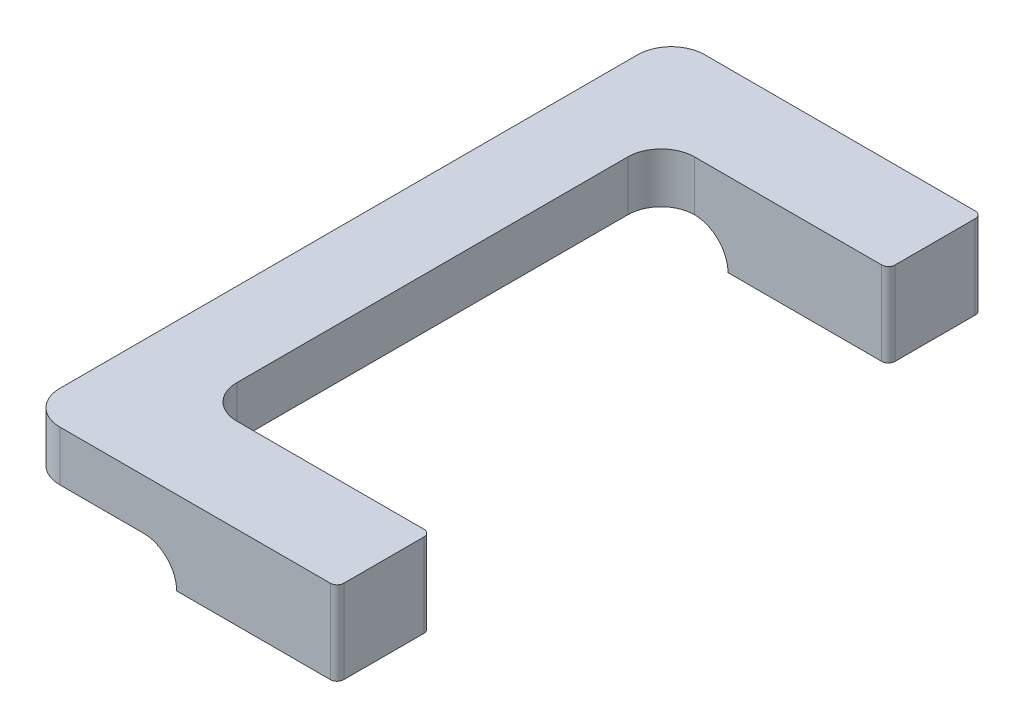
ISO-10303-21;
HEADER;
FILE_DESCRIPTION(('STEP AP214'),'2;1');
FILE_NAME('part.step','',(''),(''),'','','');
FILE_SCHEMA(('AUTOMOTIVE_DESIGN { 1 0 10303 214 1 1 1 1 }'));
ENDSEC;
DATA;
#1=APPLICATION_CONTEXT('core data for automotive mechanical design processes');
#2=APPLICATION_PROTOCOL_DEFINITION('international standard','automotive_design',2000,#1);
#3=PRODUCT_CONTEXT('',#1,'mechanical');
#4=PRODUCT('Part','Part','',(#3));
#5=PRODUCT_RELATED_PRODUCT_CATEGORY('part','',(#4));
#6=PRODUCT_DEFINITION_FORMATION('','',#4);
#7=PRODUCT_DEFINITION_CONTEXT('part definition',#1,'design');
#8=PRODUCT_DEFINITION('design','',#6,#7);
#9=PRODUCT_DEFINITION_SHAPE('','',#8);
#10=(LENGTH_UNIT() NAMED_UNIT(*) SI_UNIT(.MILLI.,.METRE.));
#11=(NAMED_UNIT(*) PLANE_ANGLE_UNIT() SI_UNIT($,.RADIAN.));
#12=(NAMED_UNIT(*) SI_UNIT($,.STERADIAN.) SOLID_ANGLE_UNIT());
#13=UNCERTAINTY_MEASURE_WITH_UNIT(LENGTH_MEASURE(1.E-05),#10,'distance_accuracy_value','');
#14=(GEOMETRIC_REPRESENTATION_CONTEXT(3) GLOBAL_UNCERTAINTY_ASSIGNED_CONTEXT((#13)) GLOBAL_UNIT_ASSIGNED_CONTEXT((#10,
#11,#12)) REPRESENTATION_CONTEXT('',''));
#15=CARTESIAN_POINT('',(0.,0.,0.));
#16=DIRECTION('',(0.,0.,1.));
#17=DIRECTION('',(1.,0.,0.));
#18=AXIS2_PLACEMENT_3D('',#15,#16,#17);
#19=CARTESIAN_POINT('',(4.74707104937555,5.,13.4130487782579));
#20=DIRECTION('',(-1.,0.,0.));
#21=DIRECTION('',(0.,0.,1.));
#22=AXIS2_PLACEMENT_3D('',#19,#20,#21);
#23=PLANE('',#22);
#24=DIRECTION('',(0.,-1.,0.));
#25=VECTOR('',#24,1.);
#26=CARTESIAN_POINT('',(4.74707104937555,5.,17.4130487782579));
#27=LINE('',#26,#25);
#28=CARTESIAN_POINT('',(4.74707104937555,4.,17.4130487782579));
#29=VERTEX_POINT('',#28);
#30=CARTESIAN_POINT('',(4.74707104937555,0.,17.4130487782579));
#31=VERTEX_POINT('',#30);
#32=EDGE_CURVE('E281',#29,#31,#27,.T.);
#33=ORIENTED_EDGE('',*,*,#32,.F.);
#34=DIRECTION('',(0.,0.,-1.));
#35=VECTOR('',#34,1.);
#36=CARTESIAN_POINT('',(4.74707104937555,4.,13.4130487782579));
#37=LINE('',#36,#35);
#38=CARTESIAN_POINT('',(4.74707104937555,4.,13.4130487782579));
#39=VERTEX_POINT('',#38);
#40=EDGE_CURVE('E264',#29,#39,#37,.T.);
#41=ORIENTED_EDGE('',*,*,#40,.T.);
#42=DIRECTION('',(0.,-1.,0.));
#43=VECTOR('',#42,1.);
#44=CARTESIAN_POINT('',(4.74707104937555,5.,13.4130487782579));
#45=LINE('',#44,#43);
#46=CARTESIAN_POINT('',(4.74707104937555,0.,13.4130487782579));
#47=VERTEX_POINT('',#46);
#48=EDGE_CURVE('E283',#39,#47,#45,.T.);
#49=ORIENTED_EDGE('',*,*,#48,.T.);
#50=DIRECTION('',(0.,0.,-1.));
#51=VECTOR('',#50,1.);
#52=CARTESIAN_POINT('',(4.74707104937555,0.,13.4130487782579));
#53=LINE('',#52,#51);
#54=EDGE_CURVE('E835',#31,#47,#53,.T.);
#55=ORIENTED_EDGE('',*,*,#54,.F.);
#56=EDGE_LOOP('',(#33,#41,#49,#55));
#57=FACE_BOUND('',#56,.T.);
#58=ADVANCED_FACE('F81',(#57),#23,.T.);
#59=CARTESIAN_POINT('',(4.74707104937555,5.,13.4130487782579));
#60=DIRECTION('',(0.,0.,1.));
#61=DIRECTION('',(1.,0.,0.));
#62=AXIS2_PLACEMENT_3D('',#59,#60,#61);
#63=PLANE('',#62);
#64=ORIENTED_EDGE('',*,*,#48,.F.);
#65=DIRECTION('',(-1.,0.,0.));
#66=VECTOR('',#65,1.);
#67=CARTESIAN_POINT('',(-3.25292895062445,4.,13.4130487782579));
#68=LINE('',#67,#66);
#69=CARTESIAN_POINT('',(-3.25292895062445,4.,13.4130487782579));
#70=VERTEX_POINT('',#69);
#71=EDGE_CURVE('E830',#39,#70,#68,.T.);
#72=ORIENTED_EDGE('',*,*,#71,.T.);
#73=DIRECTION('',(0.,-1.,0.));
#74=VECTOR('',#73,1.);
#75=CARTESIAN_POINT('',(-3.25292895062445,5.,13.4130487782579));
#76=LINE('',#75,#74);
#77=CARTESIAN_POINT('',(-3.25292895062445,0.,13.4130487782579));
#78=VERTEX_POINT('',#77);
#79=EDGE_CURVE('E275',#70,#78,#76,.T.);
#80=ORIENTED_EDGE('',*,*,#79,.T.);
#81=DIRECTION('',(-1.,0.,0.));
#82=VECTOR('',#81,1.);
#83=CARTESIAN_POINT('',(4.74707104937555,0.,13.4130487782579));
#84=LINE('',#83,#82);
#85=EDGE_CURVE('E847',#47,#78,#84,.T.);
#86=ORIENTED_EDGE('',*,*,#85,.F.);
#87=EDGE_LOOP('',(#64,#72,#80,#86));
#88=FACE_BOUND('',#87,.T.);
#89=ADVANCED_FACE('F529',(#88),#63,.T.);
#90=CARTESIAN_POINT('',(-3.25292895062445,5.,13.4130487782579));
#91=DIRECTION('',(1.,0.,0.));
#92=DIRECTION('',(0.,0.,-1.));
#93=AXIS2_PLACEMENT_3D('',#90,#91,#92);
#94=PLANE('',#93);
#95=ORIENTED_EDGE('',*,*,#79,.F.);
#96=DIRECTION('',(0.,0.,1.));
#97=VECTOR('',#96,1.);
#98=CARTESIAN_POINT('',(-3.25292895062445,4.,13.4130487782579));
#99=LINE('',#98,#97);
#100=CARTESIAN_POINT('',(-3.25292895062445,4.,17.4130487782579));
#101=VERTEX_POINT('',#100);
#102=EDGE_CURVE('E261',#70,#101,#99,.T.);
#103=ORIENTED_EDGE('',*,*,#102,.T.);
#104=DIRECTION('',(0.,-1.,0.));
#105=VECTOR('',#104,1.);
#106=CARTESIAN_POINT('',(-3.25292895062445,5.,17.4130487782579));
#107=LINE('',#106,#105);
#108=CARTESIAN_POINT('',(-3.25292895062445,0.,17.4130487782579));
#109=VERTEX_POINT('',#108);
#110=EDGE_CURVE('E273',#101,#109,#107,.T.);
#111=ORIENTED_EDGE('',*,*,#110,.T.);
#112=DIRECTION('',(0.,0.,1.));
#113=VECTOR('',#112,1.);
#114=CARTESIAN_POINT('',(-3.25292895062445,0.,13.4130487782579));
#115=LINE('',#114,#113);
#116=EDGE_CURVE('E850',#78,#109,#115,.T.);
#117=ORIENTED_EDGE('',*,*,#116,.F.);
#118=EDGE_LOOP('',(#95,#103,#111,#117));
#119=FACE_BOUND('',#118,.T.);
#120=ADVANCED_FACE('F271',(#119),#94,.T.);
#121=CARTESIAN_POINT('',(4.74707104937555,5.,17.4130487782579));
#122=DIRECTION('',(0.,0.,-1.));
#123=DIRECTION('',(-1.,0.,0.));
#124=AXIS2_PLACEMENT_3D('',#121,#122,#123);
#125=PLANE('',#124);
#126=ORIENTED_EDGE('',*,*,#110,.F.);
#127=DIRECTION('',(1.,0.,0.));
#128=VECTOR('',#127,1.);
#129=CARTESIAN_POINT('',(-3.25292895062445,4.,17.4130487782579));
#130=LINE('',#129,#128);
#131=EDGE_CURVE('E258',#101,#29,#130,.T.);
#132=ORIENTED_EDGE('',*,*,#131,.T.);
#133=ORIENTED_EDGE('',*,*,#32,.T.);
#134=DIRECTION('',(1.,0.,0.));
#135=VECTOR('',#134,1.);
#136=CARTESIAN_POINT('',(4.74707104937555,0.,17.4130487782579));
#137=LINE('',#136,#135);
#138=EDGE_CURVE('E279',#109,#31,#137,.T.);
#139=ORIENTED_EDGE('',*,*,#138,.F.);
#140=EDGE_LOOP('',(#126,#132,#133,#139));
#141=FACE_BOUND('',#140,.T.);
#142=ADVANCED_FACE('F277',(#141),#125,.T.);
#143=CARTESIAN_POINT('',(4.74707104937555,5.,-19.5869512217421));
#144=DIRECTION('',(-1.,0.,0.));
#145=DIRECTION('',(0.,0.,1.));
#146=AXIS2_PLACEMENT_3D('',#143,#144,#145);
#147=PLANE('',#146);
#148=DIRECTION('',(0.,-1.,0.));
#149=VECTOR('',#148,1.);
#150=CARTESIAN_POINT('',(4.74707104937555,5.,-15.5869512217421));
#151=LINE('',#150,#149);
#152=CARTESIAN_POINT('',(4.74707104937555,4.,-15.5869512217421));
#153=VERTEX_POINT('',#152);
#154=CARTESIAN_POINT('',(4.74707104937555,0.,-15.5869512217421));
#155=VERTEX_POINT('',#154);
#156=EDGE_CURVE('E336',#153,#155,#151,.T.);
#157=ORIENTED_EDGE('',*,*,#156,.F.);
#158=DIRECTION('',(0.,0.,-1.));
#159=VECTOR('',#158,1.);
#160=CARTESIAN_POINT('',(4.74707104937555,4.,-19.5869512217421));
#161=LINE('',#160,#159);
#162=CARTESIAN_POINT('',(4.74707104937555,4.,-19.5869512217421));
#163=VERTEX_POINT('',#162);
#164=EDGE_CURVE('E836',#153,#163,#161,.T.);
#165=ORIENTED_EDGE('',*,*,#164,.T.);
#166=DIRECTION('',(0.,-1.,0.));
#167=VECTOR('',#166,1.);
#168=CARTESIAN_POINT('',(4.74707104937555,5.,-19.5869512217421));
#169=LINE('',#168,#167);
#170=CARTESIAN_POINT('',(4.74707104937555,0.,-19.5869512217421));
#171=VERTEX_POINT('',#170);
#172=EDGE_CURVE('E342',#163,#171,#169,.T.);
#173=ORIENTED_EDGE('',*,*,#172,.T.);
#174=DIRECTION('',(0.,0.,-1.));
#175=VECTOR('',#174,1.);
#176=CARTESIAN_POINT('',(4.74707104937555,0.,-19.5869512217421));
#177=LINE('',#176,#175);
#178=EDGE_CURVE('E315',#155,#171,#177,.T.);
#179=ORIENTED_EDGE('',*,*,#178,.F.);
#180=EDGE_LOOP('',(#157,#165,#173,#179));
#181=FACE_BOUND('',#180,.T.);
#182=ADVANCED_FACE('F567',(#181),#147,.T.);
#183=CARTESIAN_POINT('',(4.74707104937555,5.,-19.5869512217421));
#184=DIRECTION('',(0.,0.,1.));
#185=DIRECTION('',(1.,0.,0.));
#186=AXIS2_PLACEMENT_3D('',#183,#184,#185);
#187=PLANE('',#186);
#188=ORIENTED_EDGE('',*,*,#172,.F.);
#189=DIRECTION('',(-1.,0.,0.));
#190=VECTOR('',#189,1.);
#191=CARTESIAN_POINT('',(-3.25292895062445,4.,-19.5869512217421));
#192=LINE('',#191,#190);
#193=CARTESIAN_POINT('',(-3.25292895062445,4.,-19.5869512217421));
#194=VERTEX_POINT('',#193);
#195=EDGE_CURVE('E824',#163,#194,#192,.T.);
#196=ORIENTED_EDGE('',*,*,#195,.T.);
#197=DIRECTION('',(0.,-1.,0.));
#198=VECTOR('',#197,1.);
#199=CARTESIAN_POINT('',(-3.25292895062445,5.,-19.5869512217421));
#200=LINE('',#199,#198);
#201=CARTESIAN_POINT('',(-3.25292895062445,0.,-19.5869512217421));
#202=VERTEX_POINT('',#201);
#203=EDGE_CURVE('E340',#194,#202,#200,.T.);
#204=ORIENTED_EDGE('',*,*,#203,.T.);
#205=DIRECTION('',(-1.,0.,0.));
#206=VECTOR('',#205,1.);
#207=CARTESIAN_POINT('',(4.74707104937555,0.,-19.5869512217421));
#208=LINE('',#207,#206);
#209=EDGE_CURVE('E327',#171,#202,#208,.T.);
#210=ORIENTED_EDGE('',*,*,#209,.F.);
#211=EDGE_LOOP('',(#188,#196,#204,#210));
#212=FACE_BOUND('',#211,.T.);
#213=ADVANCED_FACE('F563',(#212),#187,.T.);
#214=CARTESIAN_POINT('',(-3.25292895062445,5.,-19.5869512217421));
#215=DIRECTION('',(1.,0.,0.));
#216=DIRECTION('',(0.,0.,-1.));
#217=AXIS2_PLACEMENT_3D('',#214,#215,#216);
#218=PLANE('',#217);
#219=ORIENTED_EDGE('',*,*,#203,.F.);
#220=DIRECTION('',(0.,0.,1.));
#221=VECTOR('',#220,1.);
#222=CARTESIAN_POINT('',(-3.25292895062445,4.,-19.5869512217421));
#223=LINE('',#222,#221);
#224=CARTESIAN_POINT('',(-3.25292895062445,4.,-15.5869512217421));
#225=VERTEX_POINT('',#224);
#226=EDGE_CURVE('E822',#194,#225,#223,.T.);
#227=ORIENTED_EDGE('',*,*,#226,.T.);
#228=DIRECTION('',(0.,-1.,0.));
#229=VECTOR('',#228,1.);
#230=CARTESIAN_POINT('',(-3.25292895062445,5.,-15.5869512217421));
#231=LINE('',#230,#229);
#232=CARTESIAN_POINT('',(-3.25292895062445,0.,-15.5869512217421));
#233=VERTEX_POINT('',#232);
#234=EDGE_CURVE('E338',#225,#233,#231,.T.);
#235=ORIENTED_EDGE('',*,*,#234,.T.);
#236=DIRECTION('',(0.,0.,1.));
#237=VECTOR('',#236,1.);
#238=CARTESIAN_POINT('',(-3.25292895062445,0.,-19.5869512217421));
#239=LINE('',#238,#237);
#240=EDGE_CURVE('E330',#202,#233,#239,.T.);
#241=ORIENTED_EDGE('',*,*,#240,.F.);
#242=EDGE_LOOP('',(#219,#227,#235,#241));
#243=FACE_BOUND('',#242,.T.);
#244=ADVANCED_FACE('F559',(#243),#218,.T.);
#245=CARTESIAN_POINT('',(4.74707104937555,5.,-15.5869512217421));
#246=DIRECTION('',(0.,0.,-1.));
#247=DIRECTION('',(-1.,0.,0.));
#248=AXIS2_PLACEMENT_3D('',#245,#246,#247);
#249=PLANE('',#248);
#250=ORIENTED_EDGE('',*,*,#234,.F.);
#251=DIRECTION('',(1.,0.,0.));
#252=VECTOR('',#251,1.);
#253=CARTESIAN_POINT('',(-3.25292895062445,4.,-15.5869512217421));
#254=LINE('',#253,#252);
#255=EDGE_CURVE('E827',#225,#153,#254,.T.);
#256=ORIENTED_EDGE('',*,*,#255,.T.);
#257=ORIENTED_EDGE('',*,*,#156,.T.);
#258=DIRECTION('',(1.,0.,0.));
#259=VECTOR('',#258,1.);
#260=CARTESIAN_POINT('',(4.74707104937555,0.,-15.5869512217421));
#261=LINE('',#260,#259);
#262=EDGE_CURVE('E333',#233,#155,#261,.T.);
#263=ORIENTED_EDGE('',*,*,#262,.F.);
#264=EDGE_LOOP('',(#250,#256,#257,#263));
#265=FACE_BOUND('',#264,.T.);
#266=ADVANCED_FACE('F556',(#265),#249,.T.);
#267=CARTESIAN_POINT('',(0.,5.,0.));
#268=DIRECTION('',(0.,1.,0.));
#269=DIRECTION('',(0.,0.,1.));
#270=AXIS2_PLACEMENT_3D('',#267,#268,#269);
#271=PLANE('',#270);
#272=DIRECTION('',(0.,0.,-1.));
#273=VECTOR('',#272,1.);
#274=CARTESIAN_POINT('',(5.54707104937555,5.,0.));
#275=LINE('',#274,#273);
#276=CARTESIAN_POINT('',(5.54707104937555,5.,-15.1869512217421));
#277=VERTEX_POINT('',#276);
#278=CARTESIAN_POINT('',(5.54707104937555,5.,-19.9869512217421));
#279=VERTEX_POINT('',#278);
#280=EDGE_CURVE('E345',#277,#279,#275,.T.);
#281=ORIENTED_EDGE('',*,*,#280,.T.);
#282=CARTESIAN_POINT('',(5.14707104937555,5.,-19.9869512217421));
#283=DIRECTION('',(0.,1.,0.));
#284=DIRECTION('',(0.,0.,1.));
#285=AXIS2_PLACEMENT_3D('',#282,#283,#284);
#286=CIRCLE('',#285,0.4);
#287=CARTESIAN_POINT('',(5.14707104937555,5.,-20.3869512217421));
#288=VERTEX_POINT('',#287);
#289=EDGE_CURVE('E431',#279,#288,#286,.T.);
#290=ORIENTED_EDGE('',*,*,#289,.T.);
#291=DIRECTION('',(-1.,0.,0.));
#292=VECTOR('',#291,1.);
#293=CARTESIAN_POINT('',(0.,5.,-20.3869512217421));
#294=LINE('',#293,#292);
#295=CARTESIAN_POINT('',(-11.0529289506244,5.,-20.3869512217421));
#296=VERTEX_POINT('',#295);
#297=EDGE_CURVE('E348',#288,#296,#294,.T.);
#298=ORIENTED_EDGE('',*,*,#297,.T.);
#299=CARTESIAN_POINT('',(-11.0529289506244,5.,-18.3869512217421));
#300=DIRECTION('',(0.,1.,0.));
#301=DIRECTION('',(0.,0.,1.));
#302=AXIS2_PLACEMENT_3D('',#299,#300,#301);
#303=CIRCLE('',#302,2.);
#304=CARTESIAN_POINT('',(-13.0529289506244,5.,-18.3869512217421));
#305=VERTEX_POINT('',#304);
#306=EDGE_CURVE('E387',#296,#305,#303,.T.);
#307=ORIENTED_EDGE('',*,*,#306,.T.);
#308=DIRECTION('',(0.,0.,1.));
#309=VECTOR('',#308,1.);
#310=CARTESIAN_POINT('',(-13.0529289506244,5.,-20.3869512217421));
#311=LINE('',#310,#309);
#312=CARTESIAN_POINT('',(-13.0529289506244,5.,16.2130487782579));
#313=VERTEX_POINT('',#312);
#314=EDGE_CURVE('E293',#305,#313,#311,.T.);
#315=ORIENTED_EDGE('',*,*,#314,.T.);
#316=CARTESIAN_POINT('',(-11.0529289506244,5.,16.2130487782579));
#317=DIRECTION('',(0.,1.,0.));
#318=DIRECTION('',(0.,0.,1.));
#319=AXIS2_PLACEMENT_3D('',#316,#317,#318);
#320=CIRCLE('',#319,2.);
#321=CARTESIAN_POINT('',(-11.0529289506244,5.,18.2130487782579));
#322=VERTEX_POINT('',#321);
#323=EDGE_CURVE('E385',#313,#322,#320,.T.);
#324=ORIENTED_EDGE('',*,*,#323,.T.);
#325=DIRECTION('',(1.,0.,0.));
#326=VECTOR('',#325,1.);
#327=CARTESIAN_POINT('',(-13.0529289506244,5.,18.2130487782579));
#328=LINE('',#327,#326);
#329=CARTESIAN_POINT('',(5.14707104937555,5.,18.2130487782579));
#330=VERTEX_POINT('',#329);
#331=EDGE_CURVE('E318',#322,#330,#328,.T.);
#332=ORIENTED_EDGE('',*,*,#331,.T.);
#333=CARTESIAN_POINT('',(5.14707104937555,5.,17.8130487782579));
#334=DIRECTION('',(0.,1.,0.));
#335=DIRECTION('',(0.,0.,1.));
#336=AXIS2_PLACEMENT_3D('',#333,#334,#335);
#337=CIRCLE('',#336,0.4);
#338=CARTESIAN_POINT('',(5.54707104937555,5.,17.8130487782579));
#339=VERTEX_POINT('',#338);
#340=EDGE_CURVE('E425',#330,#339,#337,.T.);
#341=ORIENTED_EDGE('',*,*,#340,.T.);
#342=DIRECTION('',(0.,0.,-1.));
#343=VECTOR('',#342,1.);
#344=CARTESIAN_POINT('',(5.54707104937555,5.,0.));
#345=LINE('',#344,#343);
#346=CARTESIAN_POINT('',(5.54707104937555,5.,13.0130487782579));
#347=VERTEX_POINT('',#346);
#348=EDGE_CURVE('E290',#339,#347,#345,.T.);
#349=ORIENTED_EDGE('',*,*,#348,.T.);
#350=CARTESIAN_POINT('',(5.14707104937555,5.,13.0130487782579));
#351=DIRECTION('',(0.,1.,0.));
#352=DIRECTION('',(0.,0.,1.));
#353=AXIS2_PLACEMENT_3D('',#350,#351,#352);
#354=CIRCLE('',#353,0.4);
#355=CARTESIAN_POINT('',(5.14707104937555,5.,12.6130487782579));
#356=VERTEX_POINT('',#355);
#357=EDGE_CURVE('E427',#347,#356,#354,.T.);
#358=ORIENTED_EDGE('',*,*,#357,.T.);
#359=DIRECTION('',(-1.,0.,0.));
#360=VECTOR('',#359,1.);
#361=CARTESIAN_POINT('',(-4.05292895062445,5.,12.6130487782579));
#362=LINE('',#361,#360);
#363=CARTESIAN_POINT('',(-6.05292895062444,5.,12.6130487782579));
#364=VERTEX_POINT('',#363);
#365=EDGE_CURVE('E321',#356,#364,#362,.T.);
#366=ORIENTED_EDGE('',*,*,#365,.T.);
#367=CARTESIAN_POINT('',(-6.05292895062444,5.,10.6130487782579));
#368=DIRECTION('',(0.,1.,0.));
#369=DIRECTION('',(0.,0.,1.));
#370=AXIS2_PLACEMENT_3D('',#367,#368,#369);
#371=CIRCLE('',#370,2.);
#372=CARTESIAN_POINT('',(-8.05292895062444,5.,10.6130487782579));
#373=VERTEX_POINT('',#372);
#374=EDGE_CURVE('E405',#364,#373,#371,.F.);
#375=ORIENTED_EDGE('',*,*,#374,.T.);
#376=DIRECTION('',(0.,0.,-1.));
#377=VECTOR('',#376,1.);
#378=CARTESIAN_POINT('',(-8.05292895062444,5.,12.6130487782579));
#379=LINE('',#378,#377);
#380=CARTESIAN_POINT('',(-8.05292895062444,5.,-12.7869512217421));
#381=VERTEX_POINT('',#380);
#382=EDGE_CURVE('E306',#373,#381,#379,.T.);
#383=ORIENTED_EDGE('',*,*,#382,.T.);
#384=CARTESIAN_POINT('',(-6.05292895062444,5.,-12.7869512217421));
#385=DIRECTION('',(0.,1.,0.));
#386=DIRECTION('',(0.,0.,1.));
#387=AXIS2_PLACEMENT_3D('',#384,#385,#386);
#388=CIRCLE('',#387,2.);
#389=CARTESIAN_POINT('',(-6.05292895062444,5.,-14.7869512217421));
#390=VERTEX_POINT('',#389);
#391=EDGE_CURVE('E409',#381,#390,#388,.F.);
#392=ORIENTED_EDGE('',*,*,#391,.T.);
#393=DIRECTION('',(1.,0.,0.));
#394=VECTOR('',#393,1.);
#395=CARTESIAN_POINT('',(0.,5.,-14.7869512217421));
#396=LINE('',#395,#394);
#397=CARTESIAN_POINT('',(5.14707104937555,5.,-14.7869512217421));
#398=VERTEX_POINT('',#397);
#399=EDGE_CURVE('E351',#390,#398,#396,.T.);
#400=ORIENTED_EDGE('',*,*,#399,.T.);
#401=CARTESIAN_POINT('',(5.14707104937555,5.,-15.1869512217421));
#402=DIRECTION('',(0.,1.,0.));
#403=DIRECTION('',(0.,0.,1.));
#404=AXIS2_PLACEMENT_3D('',#401,#402,#403);
#405=CIRCLE('',#404,0.4);
#406=EDGE_CURVE('E429',#398,#277,#405,.T.);
#407=ORIENTED_EDGE('',*,*,#406,.T.);
#408=EDGE_LOOP('',(#281,#290,#298,#307,#315,#324,#332,#341,#349,#358,#366,#375,#383,#392,#400,#407));
#409=FACE_BOUND('',#408,.T.);
#410=ADVANCED_FACE('F450',(#409),#271,.T.);
#411=CARTESIAN_POINT('',(0.,0.,0.));
#412=DIRECTION('',(0.,1.,0.));
#413=DIRECTION('',(0.,0.,1.));
#414=AXIS2_PLACEMENT_3D('',#411,#412,#413);
#415=PLANE('',#414);
#416=DIRECTION('',(-1.,0.,0.));
#417=VECTOR('',#416,1.);
#418=CARTESIAN_POINT('',(0.,0.,-20.3869512217421));
#419=LINE('',#418,#417);
#420=CARTESIAN_POINT('',(5.14707104937555,0.,-20.3869512217421));
#421=VERTEX_POINT('',#420);
#422=CARTESIAN_POINT('',(-4.05292895062445,0.,-20.3869512217421));
#423=VERTEX_POINT('',#422);
#424=EDGE_CURVE('E357',#421,#423,#419,.T.);
#425=ORIENTED_EDGE('',*,*,#424,.F.);
#426=CARTESIAN_POINT('',(5.14707104937555,0.,-19.9869512217421));
#427=DIRECTION('',(0.,1.,0.));
#428=DIRECTION('',(0.,0.,1.));
#429=AXIS2_PLACEMENT_3D('',#426,#427,#428);
#430=CIRCLE('',#429,0.4);
#431=CARTESIAN_POINT('',(5.54707104937555,0.,-19.9869512217421));
#432=VERTEX_POINT('',#431);
#433=EDGE_CURVE('E418',#421,#432,#430,.F.);
#434=ORIENTED_EDGE('',*,*,#433,.T.);
#435=DIRECTION('',(0.,0.,-1.));
#436=VECTOR('',#435,1.);
#437=CARTESIAN_POINT('',(5.54707104937555,0.,0.));
#438=LINE('',#437,#436);
#439=CARTESIAN_POINT('',(5.54707104937555,0.,-15.1869512217421));
#440=VERTEX_POINT('',#439);
#441=EDGE_CURVE('E344',#440,#432,#438,.T.);
#442=ORIENTED_EDGE('',*,*,#441,.F.);
#443=CARTESIAN_POINT('',(5.14707104937555,0.,-15.1869512217421));
#444=DIRECTION('',(0.,1.,0.));
#445=DIRECTION('',(0.,0.,1.));
#446=AXIS2_PLACEMENT_3D('',#443,#444,#445);
#447=CIRCLE('',#446,0.4);
#448=CARTESIAN_POINT('',(5.14707104937555,0.,-14.7869512217421));
#449=VERTEX_POINT('',#448);
#450=EDGE_CURVE('E416',#440,#449,#447,.F.);
#451=ORIENTED_EDGE('',*,*,#450,.T.);
#452=DIRECTION('',(1.,0.,0.));
#453=VECTOR('',#452,1.);
#454=CARTESIAN_POINT('',(0.,0.,-14.7869512217421));
#455=LINE('',#454,#453);
#456=CARTESIAN_POINT('',(-4.05292895062445,0.,-14.7869512217421));
#457=VERTEX_POINT('',#456);
#458=EDGE_CURVE('E349',#457,#449,#455,.T.);
#459=ORIENTED_EDGE('',*,*,#458,.F.);
#460=DIRECTION('',(0.,0.,1.));
#461=VECTOR('',#460,1.);
#462=CARTESIAN_POINT('',(-4.05292895062445,0.,0.));
#463=LINE('',#462,#461);
#464=EDGE_CURVE('E359',#423,#457,#463,.T.);
#465=ORIENTED_EDGE('',*,*,#464,.F.);
#466=EDGE_LOOP('',(#425,#434,#442,#451,#459,#465));
#467=FACE_BOUND('',#466,.T.);
#468=ORIENTED_EDGE('',*,*,#178,.T.);
#469=ORIENTED_EDGE('',*,*,#209,.T.);
#470=ORIENTED_EDGE('',*,*,#240,.T.);
#471=ORIENTED_EDGE('',*,*,#262,.T.);
#472=EDGE_LOOP('',(#468,#469,#470,#471));
#473=FACE_BOUND('',#472,.T.);
#474=ADVANCED_FACE('F574',(#467,#473),#415,.F.);
#475=CARTESIAN_POINT('',(5.54707104937555,5.,0.));
#476=DIRECTION('',(-1.,0.,0.));
#477=DIRECTION('',(0.,0.,1.));
#478=AXIS2_PLACEMENT_3D('',#475,#476,#477);
#479=PLANE('',#478);
#480=ORIENTED_EDGE('',*,*,#441,.T.);
#481=DIRECTION('',(0.,-1.,0.));
#482=VECTOR('',#481,1.);
#483=CARTESIAN_POINT('',(5.54707104937555,5.,-19.9869512217421));
#484=LINE('',#483,#482);
#485=EDGE_CURVE('E423',#432,#279,#484,.F.);
#486=ORIENTED_EDGE('',*,*,#485,.T.);
#487=ORIENTED_EDGE('',*,*,#280,.F.);
#488=DIRECTION('',(0.,-1.,0.));
#489=VECTOR('',#488,1.);
#490=CARTESIAN_POINT('',(5.54707104937555,5.,-15.1869512217421));
#491=LINE('',#490,#489);
#492=EDGE_CURVE('E420',#277,#440,#491,.T.);
#493=ORIENTED_EDGE('',*,*,#492,.T.);
#494=EDGE_LOOP('',(#480,#486,#487,#493));
#495=FACE_BOUND('',#494,.T.);
#496=ADVANCED_FACE('F492',(#495),#479,.F.);
#497=CARTESIAN_POINT('',(0.,5.,-20.3869512217421));
#498=DIRECTION('',(0.,0.,1.));
#499=DIRECTION('',(1.,0.,0.));
#500=AXIS2_PLACEMENT_3D('',#497,#498,#499);
#501=PLANE('',#500);
#502=ORIENTED_EDGE('',*,*,#297,.F.);
#503=DIRECTION('',(0.,-1.,0.));
#504=VECTOR('',#503,1.);
#505=CARTESIAN_POINT('',(5.14707104937555,5.,-20.3869512217421));
#506=LINE('',#505,#504);
#507=EDGE_CURVE('E413',#288,#421,#506,.T.);
#508=ORIENTED_EDGE('',*,*,#507,.T.);
#509=ORIENTED_EDGE('',*,*,#424,.T.);
#510=CARTESIAN_POINT('',(-6.05292895062445,0.,-20.3869512217421));
#511=DIRECTION('',(0.,0.,1.));
#512=DIRECTION('',(1.,0.,0.));
#513=AXIS2_PLACEMENT_3D('',#510,#511,#512);
#514=CIRCLE('',#513,2.);
#515=CARTESIAN_POINT('',(-6.05292895062445,2.,-20.3869512217421));
#516=VERTEX_POINT('',#515);
#517=EDGE_CURVE('E396',#423,#516,#514,.T.);
#518=ORIENTED_EDGE('',*,*,#517,.T.);
#519=DIRECTION('',(-1.,0.,0.));
#520=VECTOR('',#519,1.);
#521=CARTESIAN_POINT('',(-4.05292895062445,2.,-20.3869512217421));
#522=LINE('',#521,#520);
#523=CARTESIAN_POINT('',(-11.0529289506244,2.,-20.3869512217421));
#524=VERTEX_POINT('',#523);
#525=EDGE_CURVE('E302',#516,#524,#522,.T.);
#526=ORIENTED_EDGE('',*,*,#525,.T.);
#527=DIRECTION('',(0.,1.,0.));
#528=VECTOR('',#527,1.);
#529=CARTESIAN_POINT('',(-11.0529289506244,5.,-20.3869512217421));
#530=LINE('',#529,#528);
#531=EDGE_CURVE('E382',#524,#296,#530,.T.);
#532=ORIENTED_EDGE('',*,*,#531,.T.);
#533=EDGE_LOOP('',(#502,#508,#509,#518,#526,#532));
#534=FACE_BOUND('',#533,.T.);
#535=ADVANCED_FACE('F501',(#534),#501,.F.);
#536=CARTESIAN_POINT('',(0.,5.,-14.7869512217421));
#537=DIRECTION('',(0.,0.,-1.));
#538=DIRECTION('',(-1.,0.,0.));
#539=AXIS2_PLACEMENT_3D('',#536,#537,#538);
#540=PLANE('',#539);
#541=ORIENTED_EDGE('',*,*,#458,.T.);
#542=DIRECTION('',(0.,-1.,0.));
#543=VECTOR('',#542,1.);
#544=CARTESIAN_POINT('',(5.14707104937555,5.,-14.7869512217421));
#545=LINE('',#544,#543);
#546=EDGE_CURVE('E433',#449,#398,#545,.F.);
#547=ORIENTED_EDGE('',*,*,#546,.T.);
#548=ORIENTED_EDGE('',*,*,#399,.F.);
#549=DIRECTION('',(0.,1.,0.));
#550=VECTOR('',#549,1.);
#551=CARTESIAN_POINT('',(-6.05292895062444,5.,-14.7869512217421));
#552=LINE('',#551,#550);
#553=CARTESIAN_POINT('',(-6.05292895062444,2.,-14.7869512217421));
#554=VERTEX_POINT('',#553);
#555=EDGE_CURVE('E380',#390,#554,#552,.F.);
#556=ORIENTED_EDGE('',*,*,#555,.T.);
#557=CARTESIAN_POINT('',(-6.05292895062445,0.,-14.7869512217421));
#558=DIRECTION('',(0.,0.,-1.));
#559=DIRECTION('',(-1.,0.,0.));
#560=AXIS2_PLACEMENT_3D('',#557,#558,#559);
#561=CIRCLE('',#560,2.);
#562=EDGE_CURVE('E398',#554,#457,#561,.T.);
#563=ORIENTED_EDGE('',*,*,#562,.T.);
#564=EDGE_LOOP('',(#541,#547,#548,#556,#563));
#565=FACE_BOUND('',#564,.T.);
#566=ADVANCED_FACE('F483',(#565),#540,.F.);
#567=CARTESIAN_POINT('',(-8.05292895062444,2.,12.6130487782579));
#568=DIRECTION('',(1.,0.,0.));
#569=DIRECTION('',(0.,0.,-1.));
#570=AXIS2_PLACEMENT_3D('',#567,#568,#569);
#571=PLANE('',#570);
#572=ORIENTED_EDGE('',*,*,#382,.F.);
#573=DIRECTION('',(0.,1.,0.));
#574=VECTOR('',#573,1.);
#575=CARTESIAN_POINT('',(-8.05292895062444,2.,10.6130487782579));
#576=LINE('',#575,#574);
#577=CARTESIAN_POINT('',(-8.05292895062444,2.,10.6130487782579));
#578=VERTEX_POINT('',#577);
#579=EDGE_CURVE('E378',#373,#578,#576,.F.);
#580=ORIENTED_EDGE('',*,*,#579,.T.);
#581=DIRECTION('',(0.,0.,-1.));
#582=VECTOR('',#581,1.);
#583=CARTESIAN_POINT('',(-8.05292895062444,2.,12.6130487782579));
#584=LINE('',#583,#582);
#585=CARTESIAN_POINT('',(-8.05292895062444,2.,-12.7869512217421));
#586=VERTEX_POINT('',#585);
#587=EDGE_CURVE('E312',#578,#586,#584,.T.);
#588=ORIENTED_EDGE('',*,*,#587,.T.);
#589=DIRECTION('',(0.,1.,0.));
#590=VECTOR('',#589,1.);
#591=CARTESIAN_POINT('',(-8.05292895062444,2.,-12.7869512217421));
#592=LINE('',#591,#590);
#593=EDGE_CURVE('E375',#586,#381,#592,.T.);
#594=ORIENTED_EDGE('',*,*,#593,.T.);
#595=EDGE_LOOP('',(#572,#580,#588,#594));
#596=FACE_BOUND('',#595,.T.);
#597=ADVANCED_FACE('F473',(#596),#571,.T.);
#598=CARTESIAN_POINT('',(-4.05292895062445,2.,12.6130487782579));
#599=DIRECTION('',(0.,0.,-1.));
#600=DIRECTION('',(-1.,0.,0.));
#601=AXIS2_PLACEMENT_3D('',#598,#599,#600);
#602=PLANE('',#601);
#603=ORIENTED_EDGE('',*,*,#365,.F.);
#604=DIRECTION('',(0.,-1.,0.));
#605=VECTOR('',#604,1.);
#606=CARTESIAN_POINT('',(5.14707104937555,0.,12.6130487782579));
#607=LINE('',#606,#605);
#608=CARTESIAN_POINT('',(5.14707104937555,0.,12.6130487782579));
#609=VERTEX_POINT('',#608);
#610=EDGE_CURVE('E435',#356,#609,#607,.T.);
#611=ORIENTED_EDGE('',*,*,#610,.T.);
#612=DIRECTION('',(-1.,0.,0.));
#613=VECTOR('',#612,1.);
#614=CARTESIAN_POINT('',(0.,0.,12.6130487782579));
#615=LINE('',#614,#613);
#616=CARTESIAN_POINT('',(-4.05292895062445,0.,12.6130487782579));
#617=VERTEX_POINT('',#616);
#618=EDGE_CURVE('E296',#609,#617,#615,.T.);
#619=ORIENTED_EDGE('',*,*,#618,.T.);
#620=CARTESIAN_POINT('',(-6.05292895062445,0.,12.6130487782579));
#621=DIRECTION('',(0.,0.,-1.));
#622=DIRECTION('',(-1.,0.,0.));
#623=AXIS2_PLACEMENT_3D('',#620,#621,#622);
#624=CIRCLE('',#623,2.);
#625=CARTESIAN_POINT('',(-6.05292895062444,2.,12.6130487782579));
#626=VERTEX_POINT('',#625);
#627=EDGE_CURVE('E400',#617,#626,#624,.F.);
#628=ORIENTED_EDGE('',*,*,#627,.T.);
#629=DIRECTION('',(0.,1.,0.));
#630=VECTOR('',#629,1.);
#631=CARTESIAN_POINT('',(-6.05292895062444,5.,12.6130487782579));
#632=LINE('',#631,#630);
#633=EDGE_CURVE('E372',#626,#364,#632,.T.);
#634=ORIENTED_EDGE('',*,*,#633,.T.);
#635=EDGE_LOOP('',(#603,#611,#619,#628,#634));
#636=FACE_BOUND('',#635,.T.);
#637=ADVANCED_FACE('F456',(#636),#602,.T.);
#638=CARTESIAN_POINT('',(-13.0529289506244,2.,18.2130487782579));
#639=DIRECTION('',(0.,0.,1.));
#640=DIRECTION('',(1.,0.,0.));
#641=AXIS2_PLACEMENT_3D('',#638,#639,#640);
#642=PLANE('',#641);
#643=DIRECTION('',(1.,0.,0.));
#644=VECTOR('',#643,1.);
#645=CARTESIAN_POINT('',(0.,0.,18.2130487782579));
#646=LINE('',#645,#644);
#647=CARTESIAN_POINT('',(-4.05292895062445,0.,18.2130487782579));
#648=VERTEX_POINT('',#647);
#649=CARTESIAN_POINT('',(5.14707104937555,0.,18.2130487782579));
#650=VERTEX_POINT('',#649);
#651=EDGE_CURVE('E294',#648,#650,#646,.T.);
#652=ORIENTED_EDGE('',*,*,#651,.T.);
#653=DIRECTION('',(0.,-1.,0.));
#654=VECTOR('',#653,1.);
#655=CARTESIAN_POINT('',(5.14707104937555,5.,18.2130487782579));
#656=LINE('',#655,#654);
#657=EDGE_CURVE('E12',#650,#330,#656,.F.);
#658=ORIENTED_EDGE('',*,*,#657,.T.);
#659=ORIENTED_EDGE('',*,*,#331,.F.);
#660=DIRECTION('',(0.,1.,0.));
#661=VECTOR('',#660,1.);
#662=CARTESIAN_POINT('',(-11.0529289506244,2.,18.2130487782579));
#663=LINE('',#662,#661);
#664=CARTESIAN_POINT('',(-11.0529289506244,2.,18.2130487782579));
#665=VERTEX_POINT('',#664);
#666=EDGE_CURVE('E394',#322,#665,#663,.F.);
#667=ORIENTED_EDGE('',*,*,#666,.T.);
#668=DIRECTION('',(1.,0.,0.));
#669=VECTOR('',#668,1.);
#670=CARTESIAN_POINT('',(-13.0529289506244,2.,18.2130487782579));
#671=LINE('',#670,#669);
#672=CARTESIAN_POINT('',(-6.05292895062445,2.,18.2130487782579));
#673=VERTEX_POINT('',#672);
#674=EDGE_CURVE('E309',#665,#673,#671,.T.);
#675=ORIENTED_EDGE('',*,*,#674,.T.);
#676=CARTESIAN_POINT('',(-6.05292895062445,0.,18.2130487782579));
#677=DIRECTION('',(0.,0.,1.));
#678=DIRECTION('',(1.,0.,0.));
#679=AXIS2_PLACEMENT_3D('',#676,#677,#678);
#680=CIRCLE('',#679,2.);
#681=EDGE_CURVE('E403',#673,#648,#680,.F.);
#682=ORIENTED_EDGE('',*,*,#681,.T.);
#683=EDGE_LOOP('',(#652,#658,#659,#667,#675,#682));
#684=FACE_BOUND('',#683,.T.);
#685=ADVANCED_FACE('F520',(#684),#642,.T.);
#686=CARTESIAN_POINT('',(-13.0529289506244,2.,-20.3869512217421));
#687=DIRECTION('',(-1.,0.,0.));
#688=DIRECTION('',(0.,0.,1.));
#689=AXIS2_PLACEMENT_3D('',#686,#687,#688);
#690=PLANE('',#689);
#691=ORIENTED_EDGE('',*,*,#314,.F.);
#692=DIRECTION('',(0.,1.,0.));
#693=VECTOR('',#692,1.);
#694=CARTESIAN_POINT('',(-13.0529289506244,2.,-18.3869512217421));
#695=LINE('',#694,#693);
#696=CARTESIAN_POINT('',(-13.0529289506244,2.,-18.3869512217421));
#697=VERTEX_POINT('',#696);
#698=EDGE_CURVE('E392',#305,#697,#695,.F.);
#699=ORIENTED_EDGE('',*,*,#698,.T.);
#700=DIRECTION('',(0.,0.,1.));
#701=VECTOR('',#700,1.);
#702=CARTESIAN_POINT('',(-13.0529289506244,2.,-20.3869512217421));
#703=LINE('',#702,#701);
#704=CARTESIAN_POINT('',(-13.0529289506244,2.,16.2130487782579));
#705=VERTEX_POINT('',#704);
#706=EDGE_CURVE('E305',#697,#705,#703,.T.);
#707=ORIENTED_EDGE('',*,*,#706,.T.);
#708=DIRECTION('',(0.,1.,0.));
#709=VECTOR('',#708,1.);
#710=CARTESIAN_POINT('',(-13.0529289506244,2.,16.2130487782579));
#711=LINE('',#710,#709);
#712=EDGE_CURVE('E389',#705,#313,#711,.T.);
#713=ORIENTED_EDGE('',*,*,#712,.T.);
#714=EDGE_LOOP('',(#691,#699,#707,#713));
#715=FACE_BOUND('',#714,.T.);
#716=ADVANCED_FACE('F511',(#715),#690,.T.);
#717=CARTESIAN_POINT('',(0.,2.,0.));
#718=DIRECTION('',(0.,1.,0.));
#719=DIRECTION('',(0.,0.,1.));
#720=AXIS2_PLACEMENT_3D('',#717,#718,#719);
#721=PLANE('',#720);
#722=ORIENTED_EDGE('',*,*,#525,.F.);
#723=DIRECTION('',(0.,0.,-1.));
#724=VECTOR('',#723,1.);
#725=CARTESIAN_POINT('',(-6.05292895062445,2.,-14.7869512217421));
#726=LINE('',#725,#724);
#727=EDGE_CURVE('E369',#516,#554,#726,.F.);
#728=ORIENTED_EDGE('',*,*,#727,.T.);
#729=CARTESIAN_POINT('',(-6.05292895062444,2.,-12.7869512217421));
#730=DIRECTION('',(0.,1.,0.));
#731=DIRECTION('',(0.,0.,1.));
#732=AXIS2_PLACEMENT_3D('',#729,#730,#731);
#733=CIRCLE('',#732,2.);
#734=EDGE_CURVE('E411',#554,#586,#733,.T.);
#735=ORIENTED_EDGE('',*,*,#734,.T.);
#736=ORIENTED_EDGE('',*,*,#587,.F.);
#737=CARTESIAN_POINT('',(-6.05292895062444,2.,10.6130487782579));
#738=DIRECTION('',(0.,1.,0.));
#739=DIRECTION('',(0.,0.,1.));
#740=AXIS2_PLACEMENT_3D('',#737,#738,#739);
#741=CIRCLE('',#740,2.);
#742=EDGE_CURVE('E407',#578,#626,#741,.T.);
#743=ORIENTED_EDGE('',*,*,#742,.T.);
#744=DIRECTION('',(0.,0.,-1.));
#745=VECTOR('',#744,1.);
#746=CARTESIAN_POINT('',(-6.05292895062445,2.,18.2130487782579));
#747=LINE('',#746,#745);
#748=EDGE_CURVE('E367',#626,#673,#747,.F.);
#749=ORIENTED_EDGE('',*,*,#748,.T.);
#750=ORIENTED_EDGE('',*,*,#674,.F.);
#751=CARTESIAN_POINT('',(-11.0529289506244,2.,16.2130487782579));
#752=DIRECTION('',(0.,1.,0.));
#753=DIRECTION('',(0.,0.,1.));
#754=AXIS2_PLACEMENT_3D('',#751,#752,#753);
#755=CIRCLE('',#754,2.);
#756=EDGE_CURVE('E354',#665,#705,#755,.F.);
#757=ORIENTED_EDGE('',*,*,#756,.T.);
#758=ORIENTED_EDGE('',*,*,#706,.F.);
#759=CARTESIAN_POINT('',(-11.0529289506244,2.,-18.3869512217421));
#760=DIRECTION('',(0.,1.,0.));
#761=DIRECTION('',(0.,0.,1.));
#762=AXIS2_PLACEMENT_3D('',#759,#760,#761);
#763=CIRCLE('',#762,2.);
#764=EDGE_CURVE('E365',#697,#524,#763,.F.);
#765=ORIENTED_EDGE('',*,*,#764,.T.);
#766=EDGE_LOOP('',(#722,#728,#735,#736,#743,#749,#750,#757,#758,#765));
#767=FACE_BOUND('',#766,.T.);
#768=ADVANCED_FACE('F541',(#767),#721,.F.);
#769=CARTESIAN_POINT('',(0.,0.,0.));
#770=DIRECTION('',(0.,1.,0.));
#771=DIRECTION('',(0.,0.,1.));
#772=AXIS2_PLACEMENT_3D('',#769,#770,#771);
#773=PLANE('',#772);
#774=ORIENTED_EDGE('',*,*,#618,.F.);
#775=CARTESIAN_POINT('',(5.14707104937555,0.,13.0130487782579));
#776=DIRECTION('',(0.,1.,0.));
#777=DIRECTION('',(0.,0.,1.));
#778=AXIS2_PLACEMENT_3D('',#775,#776,#777);
#779=CIRCLE('',#778,0.4);
#780=CARTESIAN_POINT('',(5.54707104937555,0.,13.0130487782579));
#781=VERTEX_POINT('',#780);
#782=EDGE_CURVE('E102',#609,#781,#779,.F.);
#783=ORIENTED_EDGE('',*,*,#782,.T.);
#784=DIRECTION('',(0.,0.,-1.));
#785=VECTOR('',#784,1.);
#786=CARTESIAN_POINT('',(5.54707104937555,0.,0.));
#787=LINE('',#786,#785);
#788=CARTESIAN_POINT('',(5.54707104937555,0.,17.8130487782579));
#789=VERTEX_POINT('',#788);
#790=EDGE_CURVE('E289',#789,#781,#787,.T.);
#791=ORIENTED_EDGE('',*,*,#790,.F.);
#792=CARTESIAN_POINT('',(5.14707104937555,0.,17.8130487782579));
#793=DIRECTION('',(0.,1.,0.));
#794=DIRECTION('',(0.,0.,1.));
#795=AXIS2_PLACEMENT_3D('',#792,#793,#794);
#796=CIRCLE('',#795,0.4);
#797=EDGE_CURVE('E96',#789,#650,#796,.F.);
#798=ORIENTED_EDGE('',*,*,#797,.T.);
#799=ORIENTED_EDGE('',*,*,#651,.F.);
#800=DIRECTION('',(0.,0.,1.));
#801=VECTOR('',#800,1.);
#802=CARTESIAN_POINT('',(-4.05292895062445,0.,0.));
#803=LINE('',#802,#801);
#804=EDGE_CURVE('E298',#617,#648,#803,.T.);
#805=ORIENTED_EDGE('',*,*,#804,.F.);
#806=EDGE_LOOP('',(#774,#783,#791,#798,#799,#805));
#807=FACE_BOUND('',#806,.T.);
#808=ORIENTED_EDGE('',*,*,#54,.T.);
#809=ORIENTED_EDGE('',*,*,#85,.T.);
#810=ORIENTED_EDGE('',*,*,#116,.T.);
#811=ORIENTED_EDGE('',*,*,#138,.T.);
#812=EDGE_LOOP('',(#808,#809,#810,#811));
#813=FACE_BOUND('',#812,.T.);
#814=ADVANCED_FACE('F459',(#807,#813),#773,.F.);
#815=CARTESIAN_POINT('',(5.54707104937555,5.,0.));
#816=DIRECTION('',(-1.,0.,0.));
#817=DIRECTION('',(0.,0.,1.));
#818=AXIS2_PLACEMENT_3D('',#815,#816,#817);
#819=PLANE('',#818);
#820=ORIENTED_EDGE('',*,*,#790,.T.);
#821=DIRECTION('',(0.,-1.,0.));
#822=VECTOR('',#821,1.);
#823=CARTESIAN_POINT('',(5.54707104937555,5.,13.0130487782579));
#824=LINE('',#823,#822);
#825=EDGE_CURVE('E89',#781,#347,#824,.F.);
#826=ORIENTED_EDGE('',*,*,#825,.T.);
#827=ORIENTED_EDGE('',*,*,#348,.F.);
#828=DIRECTION('',(0.,-1.,0.));
#829=VECTOR('',#828,1.);
#830=CARTESIAN_POINT('',(5.54707104937555,0.,17.8130487782579));
#831=LINE('',#830,#829);
#832=EDGE_CURVE('E440',#339,#789,#831,.T.);
#833=ORIENTED_EDGE('',*,*,#832,.T.);
#834=EDGE_LOOP('',(#820,#826,#827,#833));
#835=FACE_BOUND('',#834,.T.);
#836=ADVANCED_FACE('F445',(#835),#819,.F.);
#837=CARTESIAN_POINT('',(0.,4.,0.));
#838=DIRECTION('',(0.,1.,0.));
#839=DIRECTION('',(0.,0.,1.));
#840=AXIS2_PLACEMENT_3D('',#837,#838,#839);
#841=PLANE('',#840);
#842=ORIENTED_EDGE('',*,*,#226,.F.);
#843=ORIENTED_EDGE('',*,*,#195,.F.);
#844=ORIENTED_EDGE('',*,*,#164,.F.);
#845=ORIENTED_EDGE('',*,*,#255,.F.);
#846=EDGE_LOOP('',(#842,#843,#844,#845));
#847=FACE_BOUND('',#846,.T.);
#848=ADVANCED_FACE('F544',(#847),#841,.F.);
#849=CARTESIAN_POINT('',(0.,4.,0.));
#850=DIRECTION('',(0.,1.,0.));
#851=DIRECTION('',(0.,0.,1.));
#852=AXIS2_PLACEMENT_3D('',#849,#850,#851);
#853=PLANE('',#852);
#854=ORIENTED_EDGE('',*,*,#102,.F.);
#855=ORIENTED_EDGE('',*,*,#71,.F.);
#856=ORIENTED_EDGE('',*,*,#40,.F.);
#857=ORIENTED_EDGE('',*,*,#131,.F.);
#858=EDGE_LOOP('',(#854,#855,#856,#857));
#859=FACE_BOUND('',#858,.T.);
#860=ADVANCED_FACE('F260',(#859),#853,.F.);
#861=CARTESIAN_POINT('',(-6.05292895062445,0.,0.));
#862=DIRECTION('',(0.,0.,1.));
#863=DIRECTION('',(1.,0.,0.));
#864=AXIS2_PLACEMENT_3D('',#861,#862,#863);
#865=CYLINDRICAL_SURFACE('',#864,2.);
#866=ORIENTED_EDGE('',*,*,#562,.F.);
#867=ORIENTED_EDGE('',*,*,#727,.F.);
#868=ORIENTED_EDGE('',*,*,#517,.F.);
#869=ORIENTED_EDGE('',*,*,#464,.T.);
#870=EDGE_LOOP('',(#866,#867,#868,#869));
#871=FACE_BOUND('',#870,.T.);
#872=ADVANCED_FACE('F584',(#871),#865,.F.);
#873=CARTESIAN_POINT('',(-6.05292895062445,0.,0.));
#874=DIRECTION('',(0.,0.,1.));
#875=DIRECTION('',(1.,0.,0.));
#876=AXIS2_PLACEMENT_3D('',#873,#874,#875);
#877=CYLINDRICAL_SURFACE('',#876,2.);
#878=ORIENTED_EDGE('',*,*,#681,.F.);
#879=ORIENTED_EDGE('',*,*,#748,.F.);
#880=ORIENTED_EDGE('',*,*,#627,.F.);
#881=ORIENTED_EDGE('',*,*,#804,.T.);
#882=EDGE_LOOP('',(#878,#879,#880,#881));
#883=FACE_BOUND('',#882,.T.);
#884=ADVANCED_FACE('F463',(#883),#877,.F.);
#885=CARTESIAN_POINT('',(-6.05292895062444,2.,10.6130487782579));
#886=DIRECTION('',(0.,-1.,0.));
#887=DIRECTION('',(0.,0.,-1.));
#888=AXIS2_PLACEMENT_3D('',#885,#886,#887);
#889=CYLINDRICAL_SURFACE('',#888,2.);
#890=ORIENTED_EDGE('',*,*,#742,.F.);
#891=ORIENTED_EDGE('',*,*,#579,.F.);
#892=ORIENTED_EDGE('',*,*,#374,.F.);
#893=ORIENTED_EDGE('',*,*,#633,.F.);
#894=EDGE_LOOP('',(#890,#891,#892,#893));
#895=FACE_BOUND('',#894,.T.);
#896=ADVANCED_FACE('F469',(#895),#889,.F.);
#897=CARTESIAN_POINT('',(-6.05292895062444,2.,-12.7869512217421));
#898=DIRECTION('',(0.,1.,0.));
#899=DIRECTION('',(0.,0.,1.));
#900=AXIS2_PLACEMENT_3D('',#897,#898,#899);
#901=CYLINDRICAL_SURFACE('',#900,2.);
#902=ORIENTED_EDGE('',*,*,#734,.F.);
#903=ORIENTED_EDGE('',*,*,#555,.F.);
#904=ORIENTED_EDGE('',*,*,#391,.F.);
#905=ORIENTED_EDGE('',*,*,#593,.F.);
#906=EDGE_LOOP('',(#902,#903,#904,#905));
#907=FACE_BOUND('',#906,.T.);
#908=ADVANCED_FACE('F478',(#907),#901,.F.);
#909=CARTESIAN_POINT('',(-11.0529289506244,5.,-18.3869512217421));
#910=DIRECTION('',(0.,-1.,0.));
#911=DIRECTION('',(0.,0.,-1.));
#912=AXIS2_PLACEMENT_3D('',#909,#910,#911);
#913=CYLINDRICAL_SURFACE('',#912,2.);
#914=ORIENTED_EDGE('',*,*,#764,.F.);
#915=ORIENTED_EDGE('',*,*,#698,.F.);
#916=ORIENTED_EDGE('',*,*,#306,.F.);
#917=ORIENTED_EDGE('',*,*,#531,.F.);
#918=EDGE_LOOP('',(#914,#915,#916,#917));
#919=FACE_BOUND('',#918,.T.);
#920=ADVANCED_FACE('F507',(#919),#913,.T.);
#921=CARTESIAN_POINT('',(-11.0529289506244,2.,16.2130487782579));
#922=DIRECTION('',(0.,1.,0.));
#923=DIRECTION('',(0.,0.,1.));
#924=AXIS2_PLACEMENT_3D('',#921,#922,#923);
#925=CYLINDRICAL_SURFACE('',#924,2.);
#926=ORIENTED_EDGE('',*,*,#756,.F.);
#927=ORIENTED_EDGE('',*,*,#666,.F.);
#928=ORIENTED_EDGE('',*,*,#323,.F.);
#929=ORIENTED_EDGE('',*,*,#712,.F.);
#930=EDGE_LOOP('',(#926,#927,#928,#929));
#931=FACE_BOUND('',#930,.T.);
#932=ADVANCED_FACE('F516',(#931),#925,.T.);
#933=CARTESIAN_POINT('',(5.14707104937555,5.,-19.9869512217421));
#934=DIRECTION('',(0.,-1.,0.));
#935=DIRECTION('',(0.,0.,-1.));
#936=AXIS2_PLACEMENT_3D('',#933,#934,#935);
#937=CYLINDRICAL_SURFACE('',#936,0.4);
#938=ORIENTED_EDGE('',*,*,#289,.F.);
#939=ORIENTED_EDGE('',*,*,#485,.F.);
#940=ORIENTED_EDGE('',*,*,#433,.F.);
#941=ORIENTED_EDGE('',*,*,#507,.F.);
#942=EDGE_LOOP('',(#938,#939,#940,#941));
#943=FACE_BOUND('',#942,.T.);
#944=ADVANCED_FACE('F496',(#943),#937,.T.);
#945=CARTESIAN_POINT('',(5.14707104937555,5.,-15.1869512217421));
#946=DIRECTION('',(0.,-1.,0.));
#947=DIRECTION('',(0.,0.,-1.));
#948=AXIS2_PLACEMENT_3D('',#945,#946,#947);
#949=CYLINDRICAL_SURFACE('',#948,0.4);
#950=ORIENTED_EDGE('',*,*,#406,.F.);
#951=ORIENTED_EDGE('',*,*,#546,.F.);
#952=ORIENTED_EDGE('',*,*,#450,.F.);
#953=ORIENTED_EDGE('',*,*,#492,.F.);
#954=EDGE_LOOP('',(#950,#951,#952,#953));
#955=FACE_BOUND('',#954,.T.);
#956=ADVANCED_FACE('F487',(#955),#949,.T.);
#957=CARTESIAN_POINT('',(5.14707104937555,2.,13.0130487782579));
#958=DIRECTION('',(0.,1.,0.));
#959=DIRECTION('',(0.,0.,1.));
#960=AXIS2_PLACEMENT_3D('',#957,#958,#959);
#961=CYLINDRICAL_SURFACE('',#960,0.4);
#962=ORIENTED_EDGE('',*,*,#357,.F.);
#963=ORIENTED_EDGE('',*,*,#825,.F.);
#964=ORIENTED_EDGE('',*,*,#782,.F.);
#965=ORIENTED_EDGE('',*,*,#610,.F.);
#966=EDGE_LOOP('',(#962,#963,#964,#965));
#967=FACE_BOUND('',#966,.T.);
#968=ADVANCED_FACE('F454',(#967),#961,.T.);
#969=CARTESIAN_POINT('',(5.14707104937555,5.,17.8130487782579));
#970=DIRECTION('',(0.,1.,0.));
#971=DIRECTION('',(0.,0.,1.));
#972=AXIS2_PLACEMENT_3D('',#969,#970,#971);
#973=CYLINDRICAL_SURFACE('',#972,0.4);
#974=ORIENTED_EDGE('',*,*,#340,.F.);
#975=ORIENTED_EDGE('',*,*,#657,.F.);
#976=ORIENTED_EDGE('',*,*,#797,.F.);
#977=ORIENTED_EDGE('',*,*,#832,.F.);
#978=EDGE_LOOP('',(#974,#975,#976,#977));
#979=FACE_BOUND('',#978,.T.);
#980=ADVANCED_FACE('F83',(#979),#973,.T.);
#981=CLOSED_SHELL('',(#58,#89,#120,#142,#182,#213,#244,#266,#410,#474,#496,#535,#566,#597,#637,
#685,#716,#768,#814,#836,#848,#860,#872,#884,#896,#908,#920,#932,#944,#956,#968,#980));
#982=MANIFOLD_SOLID_BREP('B2',#981);
#983=ADVANCED_BREP_SHAPE_REPRESENTATION('',(#18,#982),#14);
#984=SHAPE_DEFINITION_REPRESENTATION(#9,#983);
ENDSEC;
END-ISO-10303-21;
